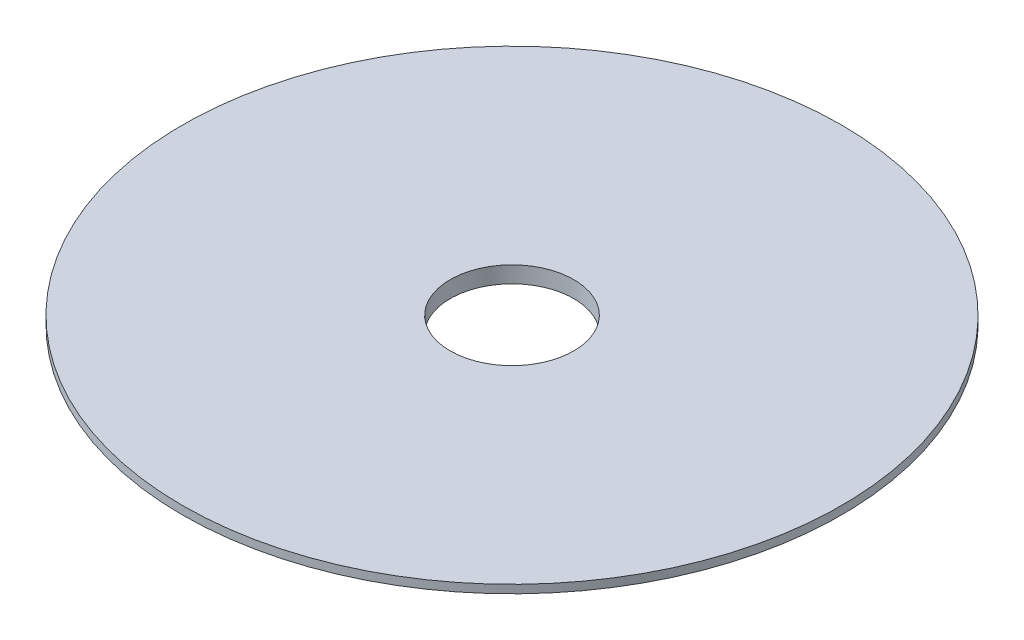
ISO-10303-21;
HEADER;
FILE_DESCRIPTION(('STEP AP214'),'2;1');
FILE_NAME('part.step','',(''),(''),'','','');
FILE_SCHEMA(('AUTOMOTIVE_DESIGN { 1 0 10303 214 1 1 1 1 }'));
ENDSEC;
DATA;
#1=APPLICATION_CONTEXT('core data for automotive mechanical design processes');
#2=APPLICATION_PROTOCOL_DEFINITION('international standard','automotive_design',2000,#1);
#3=PRODUCT_CONTEXT('',#1,'mechanical');
#4=PRODUCT('Part','Part','',(#3));
#5=PRODUCT_RELATED_PRODUCT_CATEGORY('part','',(#4));
#6=PRODUCT_DEFINITION_FORMATION('','',#4);
#7=PRODUCT_DEFINITION_CONTEXT('part definition',#1,'design');
#8=PRODUCT_DEFINITION('design','',#6,#7);
#9=PRODUCT_DEFINITION_SHAPE('','',#8);
#10=(LENGTH_UNIT() NAMED_UNIT(*) SI_UNIT(.MILLI.,.METRE.));
#11=(NAMED_UNIT(*) PLANE_ANGLE_UNIT() SI_UNIT($,.RADIAN.));
#12=(NAMED_UNIT(*) SI_UNIT($,.STERADIAN.) SOLID_ANGLE_UNIT());
#13=UNCERTAINTY_MEASURE_WITH_UNIT(LENGTH_MEASURE(1.E-05),#10,'distance_accuracy_value','');
#14=(GEOMETRIC_REPRESENTATION_CONTEXT(3) GLOBAL_UNCERTAINTY_ASSIGNED_CONTEXT((#13)) GLOBAL_UNIT_ASSIGNED_CONTEXT((#10,
#11,#12)) REPRESENTATION_CONTEXT('',''));
#15=CARTESIAN_POINT('',(0.,0.,0.));
#16=DIRECTION('',(0.,0.,1.));
#17=DIRECTION('',(1.,0.,0.));
#18=AXIS2_PLACEMENT_3D('',#15,#16,#17);
#19=CARTESIAN_POINT('',(0.,0.,0.));
#20=DIRECTION('',(0.,1.,0.));
#21=DIRECTION('',(0.,0.,1.));
#22=AXIS2_PLACEMENT_3D('',#19,#20,#21);
#23=PLANE('',#22);
#24=CARTESIAN_POINT('',(0.,0.,0.));
#25=DIRECTION('',(0.,1.,0.));
#26=DIRECTION('',(0.,0.,1.));
#27=AXIS2_PLACEMENT_3D('',#24,#25,#26);
#28=CIRCLE('',#27,7.5);
#29=CARTESIAN_POINT('',(0.,0.,7.5));
#30=VERTEX_POINT('',#29);
#31=EDGE_CURVE('E44',#30,#30,#28,.T.);
#32=ORIENTED_EDGE('',*,*,#31,.T.);
#33=EDGE_LOOP('',(#32));
#34=FACE_BOUND('',#33,.T.);
#35=CARTESIAN_POINT('',(0.,0.,0.));
#36=DIRECTION('',(0.,-1.,0.));
#37=DIRECTION('',(0.,0.,-1.));
#38=AXIS2_PLACEMENT_3D('',#35,#36,#37);
#39=CIRCLE('',#38,15.);
#40=CARTESIAN_POINT('',(0.,0.,-15.));
#41=VERTEX_POINT('',#40);
#42=EDGE_CURVE('E54',#41,#41,#39,.T.);
#43=ORIENTED_EDGE('',*,*,#42,.T.);
#44=EDGE_LOOP('',(#43));
#45=FACE_BOUND('',#44,.T.);
#46=ADVANCED_FACE('F34',(#34,#45),#23,.F.);
#47=CARTESIAN_POINT('',(0.,2.,0.));
#48=DIRECTION('',(0.,-1.,0.));
#49=DIRECTION('',(0.,0.,-1.));
#50=AXIS2_PLACEMENT_3D('',#47,#48,#49);
#51=CYLINDRICAL_SURFACE('',#50,40.);
#52=CARTESIAN_POINT('',(0.,2.,0.));
#53=DIRECTION('',(0.,1.,0.));
#54=DIRECTION('',(0.,0.,1.));
#55=AXIS2_PLACEMENT_3D('',#52,#53,#54);
#56=CIRCLE('',#55,40.);
#57=CARTESIAN_POINT('',(0.,2.,40.));
#58=VERTEX_POINT('',#57);
#59=EDGE_CURVE('E10',#58,#58,#56,.T.);
#60=ORIENTED_EDGE('',*,*,#59,.F.);
#61=EDGE_LOOP('',(#60));
#62=FACE_BOUND('',#61,.T.);
#63=CARTESIAN_POINT('',(0.,1.,0.));
#64=DIRECTION('',(0.,1.,0.));
#65=DIRECTION('',(0.,0.,1.));
#66=AXIS2_PLACEMENT_3D('',#63,#64,#65);
#67=CIRCLE('',#66,40.);
#68=CARTESIAN_POINT('',(0.,1.,40.));
#69=VERTEX_POINT('',#68);
#70=EDGE_CURVE('E37',#69,#69,#67,.T.);
#71=ORIENTED_EDGE('',*,*,#70,.T.);
#72=EDGE_LOOP('',(#71));
#73=FACE_BOUND('',#72,.T.);
#74=ADVANCED_FACE('F78',(#62,#73),#51,.T.);
#75=CARTESIAN_POINT('',(0.,2.,0.));
#76=DIRECTION('',(0.,1.,0.));
#77=DIRECTION('',(0.,0.,1.));
#78=AXIS2_PLACEMENT_3D('',#75,#76,#77);
#79=PLANE('',#78);
#80=CARTESIAN_POINT('',(0.,2.,0.));
#81=DIRECTION('',(0.,1.,0.));
#82=DIRECTION('',(0.,0.,1.));
#83=AXIS2_PLACEMENT_3D('',#80,#81,#82);
#84=CIRCLE('',#83,7.5);
#85=CARTESIAN_POINT('',(0.,2.,7.5));
#86=VERTEX_POINT('',#85);
#87=EDGE_CURVE('E48',#86,#86,#84,.T.);
#88=ORIENTED_EDGE('',*,*,#87,.F.);
#89=EDGE_LOOP('',(#88));
#90=FACE_BOUND('',#89,.T.);
#91=ORIENTED_EDGE('',*,*,#59,.T.);
#92=EDGE_LOOP('',(#91));
#93=FACE_BOUND('',#92,.T.);
#94=ADVANCED_FACE('F68',(#90,#93),#79,.T.);
#95=CARTESIAN_POINT('',(0.,1.,0.));
#96=DIRECTION('',(0.,1.,0.));
#97=DIRECTION('',(0.,0.,1.));
#98=AXIS2_PLACEMENT_3D('',#95,#96,#97);
#99=PLANE('',#98);
#100=ORIENTED_EDGE('',*,*,#70,.F.);
#101=EDGE_LOOP('',(#100));
#102=FACE_BOUND('',#101,.T.);
#103=CARTESIAN_POINT('',(0.,1.,0.));
#104=DIRECTION('',(0.,1.,0.));
#105=DIRECTION('',(0.,0.,1.));
#106=AXIS2_PLACEMENT_3D('',#103,#104,#105);
#107=CIRCLE('',#106,15.);
#108=CARTESIAN_POINT('',(0.,1.,15.));
#109=VERTEX_POINT('',#108);
#110=EDGE_CURVE('E51',#109,#109,#107,.F.);
#111=ORIENTED_EDGE('',*,*,#110,.F.);
#112=EDGE_LOOP('',(#111));
#113=FACE_BOUND('',#112,.T.);
#114=ADVANCED_FACE('F66',(#102,#113),#99,.F.);
#115=CARTESIAN_POINT('',(0.,-498.,0.));
#116=DIRECTION('',(0.,1.,0.));
#117=DIRECTION('',(0.,0.,1.));
#118=AXIS2_PLACEMENT_3D('',#115,#116,#117);
#119=CYLINDRICAL_SURFACE('',#118,7.5);
#120=ORIENTED_EDGE('',*,*,#87,.T.);
#121=EDGE_LOOP('',(#120));
#122=FACE_BOUND('',#121,.T.);
#123=ORIENTED_EDGE('',*,*,#31,.F.);
#124=EDGE_LOOP('',(#123));
#125=FACE_BOUND('',#124,.T.);
#126=ADVANCED_FACE('F62',(#122,#125),#119,.F.);
#127=CARTESIAN_POINT('',(0.,64.6396103067893,0.));
#128=DIRECTION('',(0.,-1.,0.));
#129=DIRECTION('',(0.,0.,-1.));
#130=AXIS2_PLACEMENT_3D('',#127,#128,#129);
#131=CYLINDRICAL_SURFACE('',#130,15.);
#132=ORIENTED_EDGE('',*,*,#42,.F.);
#133=EDGE_LOOP('',(#132));
#134=FACE_BOUND('',#133,.T.);
#135=ORIENTED_EDGE('',*,*,#110,.T.);
#136=EDGE_LOOP('',(#135));
#137=FACE_BOUND('',#136,.T.);
#138=ADVANCED_FACE('F59',(#134,#137),#131,.T.);
#139=CLOSED_SHELL('',(#46,#74,#94,#114,#126,#138));
#140=MANIFOLD_SOLID_BREP('B2',#139);
#141=ADVANCED_BREP_SHAPE_REPRESENTATION('',(#18,#140),#14);
#142=SHAPE_DEFINITION_REPRESENTATION(#9,#141);
ENDSEC;
END-ISO-10303-21;
